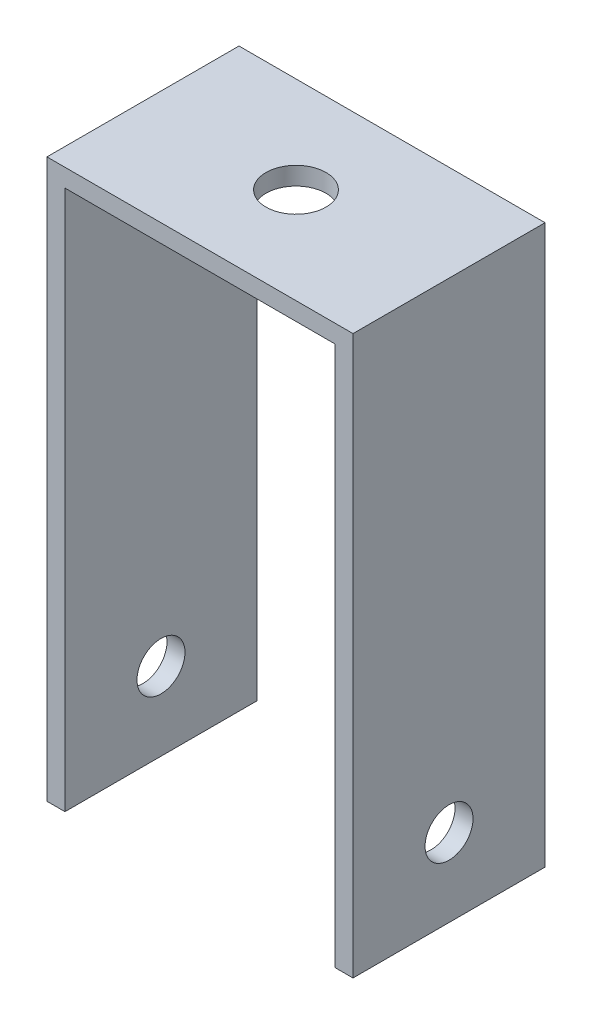
ISO-10303-21;
HEADER;
FILE_DESCRIPTION(('STEP AP214'),'2;1');
FILE_NAME('part.step','',(''),(''),'','','');
FILE_SCHEMA(('AUTOMOTIVE_DESIGN { 1 0 10303 214 1 1 1 1 }'));
ENDSEC;
DATA;
#1=APPLICATION_CONTEXT('core data for automotive mechanical design processes');
#2=APPLICATION_PROTOCOL_DEFINITION('international standard','automotive_design',2000,#1);
#3=PRODUCT_CONTEXT('',#1,'mechanical');
#4=PRODUCT('Part','Part','',(#3));
#5=PRODUCT_RELATED_PRODUCT_CATEGORY('part','',(#4));
#6=PRODUCT_DEFINITION_FORMATION('','',#4);
#7=PRODUCT_DEFINITION_CONTEXT('part definition',#1,'design');
#8=PRODUCT_DEFINITION('design','',#6,#7);
#9=PRODUCT_DEFINITION_SHAPE('','',#8);
#10=(LENGTH_UNIT() NAMED_UNIT(*) SI_UNIT(.MILLI.,.METRE.));
#11=(NAMED_UNIT(*) PLANE_ANGLE_UNIT() SI_UNIT($,.RADIAN.));
#12=(NAMED_UNIT(*) SI_UNIT($,.STERADIAN.) SOLID_ANGLE_UNIT());
#13=UNCERTAINTY_MEASURE_WITH_UNIT(LENGTH_MEASURE(1.E-05),#10,'distance_accuracy_value','');
#14=(GEOMETRIC_REPRESENTATION_CONTEXT(3) GLOBAL_UNCERTAINTY_ASSIGNED_CONTEXT((#13)) GLOBAL_UNIT_ASSIGNED_CONTEXT((#10,
#11,#12)) REPRESENTATION_CONTEXT('',''));
#15=CARTESIAN_POINT('',(0.,0.,0.));
#16=DIRECTION('',(0.,0.,1.));
#17=DIRECTION('',(1.,0.,0.));
#18=AXIS2_PLACEMENT_3D('',#15,#16,#17);
#19=CARTESIAN_POINT('',(25.5,0.,16.));
#20=DIRECTION('',(-1.,0.,0.));
#21=DIRECTION('',(0.,-1.,0.));
#22=AXIS2_PLACEMENT_3D('',#19,#20,#21);
#23=PLANE('',#22);
#24=CARTESIAN_POINT('',(25.5,-80.,0.));
#25=DIRECTION('',(1.,0.,0.));
#26=DIRECTION('',(0.,0.,-1.));
#27=AXIS2_PLACEMENT_3D('',#24,#25,#26);
#28=CIRCLE('',#27,4.00000000000001);
#29=CARTESIAN_POINT('',(25.5,-80.,-4.00000000000001));
#30=VERTEX_POINT('',#29);
#31=EDGE_CURVE('E194',#30,#30,#28,.T.);
#32=ORIENTED_EDGE('',*,*,#31,.F.);
#33=EDGE_LOOP('',(#32));
#34=FACE_BOUND('',#33,.T.);
#35=DIRECTION('',(0.,1.,0.));
#36=VECTOR('',#35,1.);
#37=CARTESIAN_POINT('',(25.5,0.,-16.));
#38=LINE('',#37,#36);
#39=CARTESIAN_POINT('',(25.5,-93.,-16.));
#40=VERTEX_POINT('',#39);
#41=CARTESIAN_POINT('',(25.5,0.,-16.));
#42=VERTEX_POINT('',#41);
#43=EDGE_CURVE('E143',#40,#42,#38,.T.);
#44=ORIENTED_EDGE('',*,*,#43,.T.);
#45=DIRECTION('',(0.,0.,-1.));
#46=VECTOR('',#45,1.);
#47=CARTESIAN_POINT('',(25.5,0.,16.));
#48=LINE('',#47,#46);
#49=CARTESIAN_POINT('',(25.5,0.,16.));
#50=VERTEX_POINT('',#49);
#51=EDGE_CURVE('E11',#50,#42,#48,.T.);
#52=ORIENTED_EDGE('',*,*,#51,.F.);
#53=DIRECTION('',(0.,1.,0.));
#54=VECTOR('',#53,1.);
#55=CARTESIAN_POINT('',(25.5,0.,16.));
#56=LINE('',#55,#54);
#57=CARTESIAN_POINT('',(25.5,-93.,16.));
#58=VERTEX_POINT('',#57);
#59=EDGE_CURVE('E166',#58,#50,#56,.T.);
#60=ORIENTED_EDGE('',*,*,#59,.F.);
#61=DIRECTION('',(0.,0.,-1.));
#62=VECTOR('',#61,1.);
#63=CARTESIAN_POINT('',(25.5,-93.,16.));
#64=LINE('',#63,#62);
#65=EDGE_CURVE('E139',#58,#40,#64,.T.);
#66=ORIENTED_EDGE('',*,*,#65,.T.);
#67=EDGE_LOOP('',(#44,#52,#60,#66));
#68=FACE_BOUND('',#67,.T.);
#69=ADVANCED_FACE('F40',(#34,#68),#23,.F.);
#70=CARTESIAN_POINT('',(-25.5,0.,16.));
#71=DIRECTION('',(0.,-1.,0.));
#72=DIRECTION('',(0.,0.,-1.));
#73=AXIS2_PLACEMENT_3D('',#70,#71,#72);
#74=PLANE('',#73);
#75=CARTESIAN_POINT('',(0.,0.,0.));
#76=DIRECTION('',(0.,1.,0.));
#77=DIRECTION('',(0.,0.,1.));
#78=AXIS2_PLACEMENT_3D('',#75,#76,#77);
#79=CIRCLE('',#78,5.);
#80=CARTESIAN_POINT('',(0.,0.,5.));
#81=VERTEX_POINT('',#80);
#82=EDGE_CURVE('E202',#81,#81,#79,.T.);
#83=ORIENTED_EDGE('',*,*,#82,.F.);
#84=EDGE_LOOP('',(#83));
#85=FACE_BOUND('',#84,.T.);
#86=DIRECTION('',(-1.,0.,0.));
#87=VECTOR('',#86,1.);
#88=CARTESIAN_POINT('',(-25.5,0.,-16.));
#89=LINE('',#88,#87);
#90=CARTESIAN_POINT('',(-25.5,0.,-16.));
#91=VERTEX_POINT('',#90);
#92=EDGE_CURVE('E147',#42,#91,#89,.T.);
#93=ORIENTED_EDGE('',*,*,#92,.T.);
#94=DIRECTION('',(0.,0.,-1.));
#95=VECTOR('',#94,1.);
#96=CARTESIAN_POINT('',(-25.5,0.,16.));
#97=LINE('',#96,#95);
#98=CARTESIAN_POINT('',(-25.5,0.,16.));
#99=VERTEX_POINT('',#98);
#100=EDGE_CURVE('E50',#99,#91,#97,.T.);
#101=ORIENTED_EDGE('',*,*,#100,.F.);
#102=DIRECTION('',(-1.,0.,0.));
#103=VECTOR('',#102,1.);
#104=CARTESIAN_POINT('',(-25.5,0.,16.));
#105=LINE('',#104,#103);
#106=EDGE_CURVE('E102',#50,#99,#105,.T.);
#107=ORIENTED_EDGE('',*,*,#106,.F.);
#108=ORIENTED_EDGE('',*,*,#51,.T.);
#109=EDGE_LOOP('',(#93,#101,#107,#108));
#110=FACE_BOUND('',#109,.T.);
#111=ADVANCED_FACE('F242',(#85,#110),#74,.F.);
#112=CARTESIAN_POINT('',(-25.5,0.,16.));
#113=DIRECTION('',(1.,0.,0.));
#114=DIRECTION('',(0.,1.,0.));
#115=AXIS2_PLACEMENT_3D('',#112,#113,#114);
#116=PLANE('',#115);
#117=CARTESIAN_POINT('',(-25.5,-80.,0.));
#118=DIRECTION('',(1.,0.,0.));
#119=DIRECTION('',(0.,0.,-1.));
#120=AXIS2_PLACEMENT_3D('',#117,#118,#119);
#121=CIRCLE('',#120,4.00000000000001);
#122=CARTESIAN_POINT('',(-25.5,-80.,-4.00000000000001));
#123=VERTEX_POINT('',#122);
#124=EDGE_CURVE('E186',#123,#123,#121,.T.);
#125=ORIENTED_EDGE('',*,*,#124,.T.);
#126=EDGE_LOOP('',(#125));
#127=FACE_BOUND('',#126,.T.);
#128=DIRECTION('',(0.,-1.,0.));
#129=VECTOR('',#128,1.);
#130=CARTESIAN_POINT('',(-25.5,0.,-16.));
#131=LINE('',#130,#129);
#132=CARTESIAN_POINT('',(-25.5,-93.,-16.));
#133=VERTEX_POINT('',#132);
#134=EDGE_CURVE('E151',#91,#133,#131,.T.);
#135=ORIENTED_EDGE('',*,*,#134,.T.);
#136=DIRECTION('',(0.,0.,-1.));
#137=VECTOR('',#136,1.);
#138=CARTESIAN_POINT('',(-25.5,-93.,16.));
#139=LINE('',#138,#137);
#140=CARTESIAN_POINT('',(-25.5,-93.,16.));
#141=VERTEX_POINT('',#140);
#142=EDGE_CURVE('E177',#141,#133,#139,.T.);
#143=ORIENTED_EDGE('',*,*,#142,.F.);
#144=DIRECTION('',(0.,-1.,0.));
#145=VECTOR('',#144,1.);
#146=CARTESIAN_POINT('',(-25.5,0.,16.));
#147=LINE('',#146,#145);
#148=EDGE_CURVE('E208',#99,#141,#147,.T.);
#149=ORIENTED_EDGE('',*,*,#148,.F.);
#150=ORIENTED_EDGE('',*,*,#100,.T.);
#151=EDGE_LOOP('',(#135,#143,#149,#150));
#152=FACE_BOUND('',#151,.T.);
#153=ADVANCED_FACE('F247',(#127,#152),#116,.F.);
#154=CARTESIAN_POINT('',(-25.5,-93.,16.));
#155=DIRECTION('',(0.,1.,0.));
#156=DIRECTION('',(0.,0.,1.));
#157=AXIS2_PLACEMENT_3D('',#154,#155,#156);
#158=PLANE('',#157);
#159=DIRECTION('',(1.,0.,0.));
#160=VECTOR('',#159,1.);
#161=CARTESIAN_POINT('',(-25.5,-93.,-16.));
#162=LINE('',#161,#160);
#163=CARTESIAN_POINT('',(-22.5,-93.,-16.));
#164=VERTEX_POINT('',#163);
#165=EDGE_CURVE('E154',#133,#164,#162,.T.);
#166=ORIENTED_EDGE('',*,*,#165,.T.);
#167=DIRECTION('',(0.,0.,-1.));
#168=VECTOR('',#167,1.);
#169=CARTESIAN_POINT('',(-22.5,-93.,16.));
#170=LINE('',#169,#168);
#171=CARTESIAN_POINT('',(-22.5,-93.,16.));
#172=VERTEX_POINT('',#171);
#173=EDGE_CURVE('E173',#172,#164,#170,.T.);
#174=ORIENTED_EDGE('',*,*,#173,.F.);
#175=DIRECTION('',(1.,0.,0.));
#176=VECTOR('',#175,1.);
#177=CARTESIAN_POINT('',(-25.5,-93.,16.));
#178=LINE('',#177,#176);
#179=EDGE_CURVE('E211',#141,#172,#178,.T.);
#180=ORIENTED_EDGE('',*,*,#179,.F.);
#181=ORIENTED_EDGE('',*,*,#142,.T.);
#182=EDGE_LOOP('',(#166,#174,#180,#181));
#183=FACE_BOUND('',#182,.T.);
#184=ADVANCED_FACE('F219',(#183),#158,.F.);
#185=CARTESIAN_POINT('',(-22.5,-3.,16.));
#186=DIRECTION('',(-1.,0.,0.));
#187=DIRECTION('',(0.,-1.,0.));
#188=AXIS2_PLACEMENT_3D('',#185,#186,#187);
#189=PLANE('',#188);
#190=CARTESIAN_POINT('',(-22.5,-80.,0.));
#191=DIRECTION('',(-1.,0.,0.));
#192=DIRECTION('',(0.,-1.,0.));
#193=AXIS2_PLACEMENT_3D('',#190,#191,#192);
#194=CIRCLE('',#193,4.00000000000001);
#195=CARTESIAN_POINT('',(-22.5,-84.,0.));
#196=VERTEX_POINT('',#195);
#197=EDGE_CURVE('E148',#196,#196,#194,.T.);
#198=ORIENTED_EDGE('',*,*,#197,.T.);
#199=EDGE_LOOP('',(#198));
#200=FACE_BOUND('',#199,.T.);
#201=DIRECTION('',(0.,1.,0.));
#202=VECTOR('',#201,1.);
#203=CARTESIAN_POINT('',(-22.5,-3.,-16.));
#204=LINE('',#203,#202);
#205=CARTESIAN_POINT('',(-22.5,-3.,-16.));
#206=VERTEX_POINT('',#205);
#207=EDGE_CURVE('E157',#164,#206,#204,.T.);
#208=ORIENTED_EDGE('',*,*,#207,.T.);
#209=DIRECTION('',(0.,0.,-1.));
#210=VECTOR('',#209,1.);
#211=CARTESIAN_POINT('',(-22.5,-3.,16.));
#212=LINE('',#211,#210);
#213=CARTESIAN_POINT('',(-22.5,-3.,16.));
#214=VERTEX_POINT('',#213);
#215=EDGE_CURVE('E132',#214,#206,#212,.T.);
#216=ORIENTED_EDGE('',*,*,#215,.F.);
#217=DIRECTION('',(0.,1.,0.));
#218=VECTOR('',#217,1.);
#219=CARTESIAN_POINT('',(-22.5,-3.,16.));
#220=LINE('',#219,#218);
#221=EDGE_CURVE('E121',#172,#214,#220,.T.);
#222=ORIENTED_EDGE('',*,*,#221,.F.);
#223=ORIENTED_EDGE('',*,*,#173,.T.);
#224=EDGE_LOOP('',(#208,#216,#222,#223));
#225=FACE_BOUND('',#224,.T.);
#226=ADVANCED_FACE('F223',(#200,#225),#189,.F.);
#227=CARTESIAN_POINT('',(-22.5,-3.,16.));
#228=DIRECTION('',(0.,1.,0.));
#229=DIRECTION('',(-1.,0.,0.));
#230=AXIS2_PLACEMENT_3D('',#227,#228,#229);
#231=PLANE('',#230);
#232=CARTESIAN_POINT('',(0.,-3.,0.));
#233=DIRECTION('',(0.,1.,0.));
#234=DIRECTION('',(-1.,0.,0.));
#235=AXIS2_PLACEMENT_3D('',#232,#233,#234);
#236=CIRCLE('',#235,5.);
#237=CARTESIAN_POINT('',(-5.,-3.,0.));
#238=VERTEX_POINT('',#237);
#239=EDGE_CURVE('E43',#238,#238,#236,.T.);
#240=ORIENTED_EDGE('',*,*,#239,.T.);
#241=EDGE_LOOP('',(#240));
#242=FACE_BOUND('',#241,.T.);
#243=DIRECTION('',(1.,0.,0.));
#244=VECTOR('',#243,1.);
#245=CARTESIAN_POINT('',(-22.5,-3.,-16.));
#246=LINE('',#245,#244);
#247=CARTESIAN_POINT('',(22.5,-3.,-16.));
#248=VERTEX_POINT('',#247);
#249=EDGE_CURVE('E130',#206,#248,#246,.T.);
#250=ORIENTED_EDGE('',*,*,#249,.T.);
#251=DIRECTION('',(0.,0.,-1.));
#252=VECTOR('',#251,1.);
#253=CARTESIAN_POINT('',(22.5,-3.,16.));
#254=LINE('',#253,#252);
#255=CARTESIAN_POINT('',(22.5,-3.,16.));
#256=VERTEX_POINT('',#255);
#257=EDGE_CURVE('E127',#256,#248,#254,.T.);
#258=ORIENTED_EDGE('',*,*,#257,.F.);
#259=DIRECTION('',(1.,0.,0.));
#260=VECTOR('',#259,1.);
#261=CARTESIAN_POINT('',(-22.5,-3.,16.));
#262=LINE('',#261,#260);
#263=EDGE_CURVE('E115',#214,#256,#262,.T.);
#264=ORIENTED_EDGE('',*,*,#263,.F.);
#265=ORIENTED_EDGE('',*,*,#215,.T.);
#266=EDGE_LOOP('',(#250,#258,#264,#265));
#267=FACE_BOUND('',#266,.T.);
#268=ADVANCED_FACE('F128',(#242,#267),#231,.F.);
#269=CARTESIAN_POINT('',(22.5,-3.,16.));
#270=DIRECTION('',(1.,0.,0.));
#271=DIRECTION('',(0.,1.,0.));
#272=AXIS2_PLACEMENT_3D('',#269,#270,#271);
#273=PLANE('',#272);
#274=CARTESIAN_POINT('',(22.5,-80.,0.));
#275=DIRECTION('',(1.,0.,0.));
#276=DIRECTION('',(0.,1.,0.));
#277=AXIS2_PLACEMENT_3D('',#274,#275,#276);
#278=CIRCLE('',#277,4.00000000000001);
#279=CARTESIAN_POINT('',(22.5,-76.,0.));
#280=VERTEX_POINT('',#279);
#281=EDGE_CURVE('E183',#280,#280,#278,.T.);
#282=ORIENTED_EDGE('',*,*,#281,.T.);
#283=EDGE_LOOP('',(#282));
#284=FACE_BOUND('',#283,.T.);
#285=DIRECTION('',(0.,-1.,0.));
#286=VECTOR('',#285,1.);
#287=CARTESIAN_POINT('',(22.5,-3.,-16.));
#288=LINE('',#287,#286);
#289=CARTESIAN_POINT('',(22.5,-93.,-16.));
#290=VERTEX_POINT('',#289);
#291=EDGE_CURVE('E88',#248,#290,#288,.T.);
#292=ORIENTED_EDGE('',*,*,#291,.T.);
#293=DIRECTION('',(0.,0.,-1.));
#294=VECTOR('',#293,1.);
#295=CARTESIAN_POINT('',(22.5,-93.,16.));
#296=LINE('',#295,#294);
#297=CARTESIAN_POINT('',(22.5,-93.,16.));
#298=VERTEX_POINT('',#297);
#299=EDGE_CURVE('E133',#298,#290,#296,.T.);
#300=ORIENTED_EDGE('',*,*,#299,.F.);
#301=DIRECTION('',(0.,-1.,0.));
#302=VECTOR('',#301,1.);
#303=CARTESIAN_POINT('',(22.5,-3.,16.));
#304=LINE('',#303,#302);
#305=EDGE_CURVE('E119',#256,#298,#304,.T.);
#306=ORIENTED_EDGE('',*,*,#305,.F.);
#307=ORIENTED_EDGE('',*,*,#257,.T.);
#308=EDGE_LOOP('',(#292,#300,#306,#307));
#309=FACE_BOUND('',#308,.T.);
#310=ADVANCED_FACE('F135',(#284,#309),#273,.F.);
#311=CARTESIAN_POINT('',(25.5,-93.,16.));
#312=DIRECTION('',(0.,1.,0.));
#313=DIRECTION('',(0.,0.,1.));
#314=AXIS2_PLACEMENT_3D('',#311,#312,#313);
#315=PLANE('',#314);
#316=DIRECTION('',(1.,0.,0.));
#317=VECTOR('',#316,1.);
#318=CARTESIAN_POINT('',(25.5,-93.,-16.));
#319=LINE('',#318,#317);
#320=EDGE_CURVE('E94',#290,#40,#319,.T.);
#321=ORIENTED_EDGE('',*,*,#320,.T.);
#322=ORIENTED_EDGE('',*,*,#65,.F.);
#323=DIRECTION('',(1.,0.,0.));
#324=VECTOR('',#323,1.);
#325=CARTESIAN_POINT('',(25.5,-93.,16.));
#326=LINE('',#325,#324);
#327=EDGE_CURVE('E59',#298,#58,#326,.T.);
#328=ORIENTED_EDGE('',*,*,#327,.F.);
#329=ORIENTED_EDGE('',*,*,#299,.T.);
#330=EDGE_LOOP('',(#321,#322,#328,#329));
#331=FACE_BOUND('',#330,.T.);
#332=ADVANCED_FACE('F231',(#331),#315,.F.);
#333=CARTESIAN_POINT('',(0.,0.,16.));
#334=DIRECTION('',(0.,0.,-1.));
#335=DIRECTION('',(-1.,0.,0.));
#336=AXIS2_PLACEMENT_3D('',#333,#334,#335);
#337=PLANE('',#336);
#338=ORIENTED_EDGE('',*,*,#59,.T.);
#339=ORIENTED_EDGE('',*,*,#106,.T.);
#340=ORIENTED_EDGE('',*,*,#148,.T.);
#341=ORIENTED_EDGE('',*,*,#179,.T.);
#342=ORIENTED_EDGE('',*,*,#221,.T.);
#343=ORIENTED_EDGE('',*,*,#263,.T.);
#344=ORIENTED_EDGE('',*,*,#305,.T.);
#345=ORIENTED_EDGE('',*,*,#327,.T.);
#346=EDGE_LOOP('',(#338,#339,#340,#341,#342,#343,#344,#345));
#347=FACE_BOUND('',#346,.T.);
#348=ADVANCED_FACE('F117',(#347),#337,.F.);
#349=CARTESIAN_POINT('',(0.,0.,-16.));
#350=DIRECTION('',(0.,0.,-1.));
#351=DIRECTION('',(-1.,0.,0.));
#352=AXIS2_PLACEMENT_3D('',#349,#350,#351);
#353=PLANE('',#352);
#354=ORIENTED_EDGE('',*,*,#43,.F.);
#355=ORIENTED_EDGE('',*,*,#320,.F.);
#356=ORIENTED_EDGE('',*,*,#291,.F.);
#357=ORIENTED_EDGE('',*,*,#249,.F.);
#358=ORIENTED_EDGE('',*,*,#207,.F.);
#359=ORIENTED_EDGE('',*,*,#165,.F.);
#360=ORIENTED_EDGE('',*,*,#134,.F.);
#361=ORIENTED_EDGE('',*,*,#92,.F.);
#362=EDGE_LOOP('',(#354,#355,#356,#357,#358,#359,#360,#361));
#363=FACE_BOUND('',#362,.T.);
#364=ADVANCED_FACE('F226',(#363),#353,.T.);
#365=CARTESIAN_POINT('',(-25.5,-80.,0.));
#366=DIRECTION('',(1.,0.,0.));
#367=DIRECTION('',(0.,0.,-1.));
#368=AXIS2_PLACEMENT_3D('',#365,#366,#367);
#369=CYLINDRICAL_SURFACE('',#368,4.00000000000001);
#370=ORIENTED_EDGE('',*,*,#31,.T.);
#371=EDGE_LOOP('',(#370));
#372=FACE_BOUND('',#371,.T.);
#373=ORIENTED_EDGE('',*,*,#281,.F.);
#374=EDGE_LOOP('',(#373));
#375=FACE_BOUND('',#374,.T.);
#376=ADVANCED_FACE('F251',(#372,#375),#369,.F.);
#377=ORIENTED_EDGE('',*,*,#124,.F.);
#378=EDGE_LOOP('',(#377));
#379=FACE_BOUND('',#378,.T.);
#380=ORIENTED_EDGE('',*,*,#197,.F.);
#381=EDGE_LOOP('',(#380));
#382=FACE_BOUND('',#381,.T.);
#383=ADVANCED_FACE('F254',(#379,#382),#369,.F.);
#384=CARTESIAN_POINT('',(0.,-10.,0.));
#385=DIRECTION('',(0.,1.,0.));
#386=DIRECTION('',(0.,0.,1.));
#387=AXIS2_PLACEMENT_3D('',#384,#385,#386);
#388=CYLINDRICAL_SURFACE('',#387,5.);
#389=ORIENTED_EDGE('',*,*,#82,.T.);
#390=EDGE_LOOP('',(#389));
#391=FACE_BOUND('',#390,.T.);
#392=ORIENTED_EDGE('',*,*,#239,.F.);
#393=EDGE_LOOP('',(#392));
#394=FACE_BOUND('',#393,.T.);
#395=ADVANCED_FACE('F260',(#391,#394),#388,.F.);
#396=CLOSED_SHELL('',(#69,#111,#153,#184,#226,#268,#310,#332,#348,#364,#376,#383,#395));
#397=MANIFOLD_SOLID_BREP('B2',#396);
#398=ADVANCED_BREP_SHAPE_REPRESENTATION('',(#18,#397),#14);
#399=SHAPE_DEFINITION_REPRESENTATION(#9,#398);
ENDSEC;
END-ISO-10303-21;
